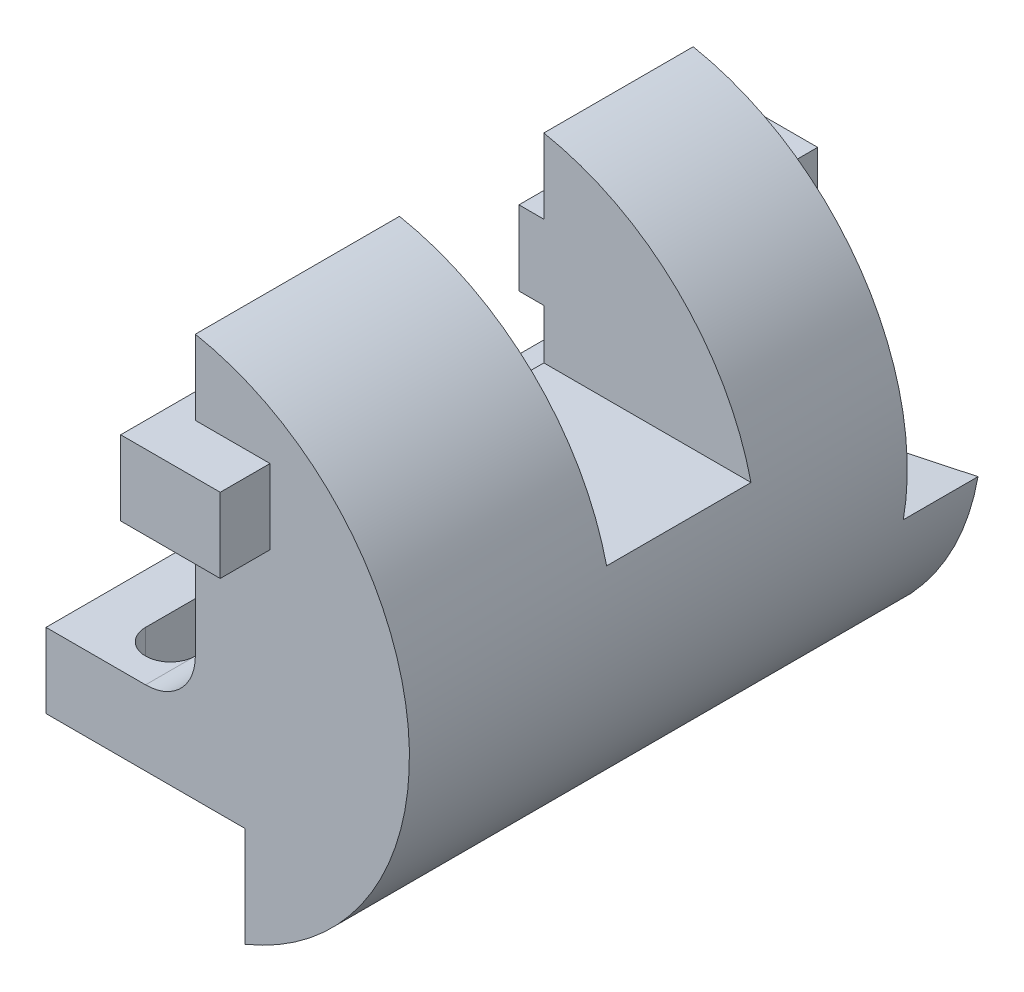
ISO-10303-21;
HEADER;
FILE_DESCRIPTION(('STEP AP214'),'2;1');
FILE_NAME('part.step','',(''),(''),'','','');
FILE_SCHEMA(('AUTOMOTIVE_DESIGN { 1 0 10303 214 1 1 1 1 }'));
ENDSEC;
DATA;
#1=APPLICATION_CONTEXT('core data for automotive mechanical design processes');
#2=APPLICATION_PROTOCOL_DEFINITION('international standard','automotive_design',2000,#1);
#3=PRODUCT_CONTEXT('',#1,'mechanical');
#4=PRODUCT('Part','Part','',(#3));
#5=PRODUCT_RELATED_PRODUCT_CATEGORY('part','',(#4));
#6=PRODUCT_DEFINITION_FORMATION('','',#4);
#7=PRODUCT_DEFINITION_CONTEXT('part definition',#1,'design');
#8=PRODUCT_DEFINITION('design','',#6,#7);
#9=PRODUCT_DEFINITION_SHAPE('','',#8);
#10=(LENGTH_UNIT() NAMED_UNIT(*) SI_UNIT(.MILLI.,.METRE.));
#11=(NAMED_UNIT(*) PLANE_ANGLE_UNIT() SI_UNIT($,.RADIAN.));
#12=(NAMED_UNIT(*) SI_UNIT($,.STERADIAN.) SOLID_ANGLE_UNIT());
#13=UNCERTAINTY_MEASURE_WITH_UNIT(LENGTH_MEASURE(1.E-05),#10,'distance_accuracy_value','');
#14=(GEOMETRIC_REPRESENTATION_CONTEXT(3) GLOBAL_UNCERTAINTY_ASSIGNED_CONTEXT((#13)) GLOBAL_UNIT_ASSIGNED_CONTEXT((#10,
#11,#12)) REPRESENTATION_CONTEXT('',''));
#15=CARTESIAN_POINT('',(0.,0.,0.));
#16=DIRECTION('',(0.,0.,1.));
#17=DIRECTION('',(1.,0.,0.));
#18=AXIS2_PLACEMENT_3D('',#15,#16,#17);
#19=CARTESIAN_POINT('',(0.,0.,100.));
#20=DIRECTION('',(-1.,0.,0.));
#21=DIRECTION('',(0.,0.,1.));
#22=AXIS2_PLACEMENT_3D('',#19,#20,#21);
#23=PLANE('',#22);
#24=DIRECTION('',(0.,-1.,0.));
#25=VECTOR('',#24,1.);
#26=CARTESIAN_POINT('',(0.,0.,30.));
#27=LINE('',#26,#25);
#28=CARTESIAN_POINT('',(0.,66.,30.));
#29=VERTEX_POINT('',#28);
#30=CARTESIAN_POINT('',(0.,51.,30.));
#31=VERTEX_POINT('',#30);
#32=EDGE_CURVE('E499',#29,#31,#27,.T.);
#33=ORIENTED_EDGE('',*,*,#32,.F.);
#34=DIRECTION('',(0.,0.,-1.));
#35=VECTOR('',#34,1.);
#36=CARTESIAN_POINT('',(0.,66.,100.));
#37=LINE('',#36,#35);
#38=CARTESIAN_POINT('',(0.,66.,0.));
#39=VERTEX_POINT('',#38);
#40=EDGE_CURVE('E261',#29,#39,#37,.T.);
#41=ORIENTED_EDGE('',*,*,#40,.T.);
#42=DIRECTION('',(0.,1.,0.));
#43=VECTOR('',#42,1.);
#44=CARTESIAN_POINT('',(0.,0.,0.));
#45=LINE('',#44,#43);
#46=CARTESIAN_POINT('',(0.,51.,0.));
#47=VERTEX_POINT('',#46);
#48=EDGE_CURVE('E325',#47,#39,#45,.T.);
#49=ORIENTED_EDGE('',*,*,#48,.F.);
#50=DIRECTION('',(0.,0.,1.));
#51=VECTOR('',#50,1.);
#52=CARTESIAN_POINT('',(0.,51.,100.));
#53=LINE('',#52,#51);
#54=EDGE_CURVE('E437',#47,#31,#53,.T.);
#55=ORIENTED_EDGE('',*,*,#54,.T.);
#56=EDGE_LOOP('',(#33,#41,#49,#55));
#57=FACE_BOUND('',#56,.T.);
#58=ADVANCED_FACE('F44',(#57),#23,.T.);
#59=CARTESIAN_POINT('',(-5.,36.,110.));
#60=DIRECTION('',(0.,1.,0.));
#61=DIRECTION('',(0.,0.,1.));
#62=AXIS2_PLACEMENT_3D('',#59,#60,#61);
#63=PLANE('',#62);
#64=DIRECTION('',(0.,0.,-1.));
#65=VECTOR('',#64,1.);
#66=CARTESIAN_POINT('',(0.,36.,100.));
#67=LINE('',#66,#65);
#68=CARTESIAN_POINT('',(0.,36.,30.));
#69=VERTEX_POINT('',#68);
#70=CARTESIAN_POINT('',(0.,36.,0.));
#71=VERTEX_POINT('',#70);
#72=EDGE_CURVE('E430',#69,#71,#67,.T.);
#73=ORIENTED_EDGE('',*,*,#72,.F.);
#74=DIRECTION('',(-1.,0.,0.));
#75=VECTOR('',#74,1.);
#76=CARTESIAN_POINT('',(-5.,36.,30.));
#77=LINE('',#76,#75);
#78=CARTESIAN_POINT('',(-5.,36.,30.));
#79=VERTEX_POINT('',#78);
#80=EDGE_CURVE('E502',#69,#79,#77,.T.);
#81=ORIENTED_EDGE('',*,*,#80,.T.);
#82=DIRECTION('',(0.,0.,-1.));
#83=VECTOR('',#82,1.);
#84=CARTESIAN_POINT('',(-5.,36.,110.));
#85=LINE('',#84,#83);
#86=CARTESIAN_POINT('',(-5.,36.,-9.99999999999999));
#87=VERTEX_POINT('',#86);
#88=EDGE_CURVE('E446',#79,#87,#85,.T.);
#89=ORIENTED_EDGE('',*,*,#88,.T.);
#90=DIRECTION('',(1.,0.,0.));
#91=VECTOR('',#90,1.);
#92=CARTESIAN_POINT('',(-5.,36.,-9.99999999999999));
#93=LINE('',#92,#91);
#94=CARTESIAN_POINT('',(15.,36.,-9.99999999999999));
#95=VERTEX_POINT('',#94);
#96=EDGE_CURVE('E482',#87,#95,#93,.T.);
#97=ORIENTED_EDGE('',*,*,#96,.T.);
#98=DIRECTION('',(0.,0.,-1.));
#99=VECTOR('',#98,1.);
#100=CARTESIAN_POINT('',(15.,36.,110.));
#101=LINE('',#100,#99);
#102=CARTESIAN_POINT('',(15.,36.,0.));
#103=VERTEX_POINT('',#102);
#104=EDGE_CURVE('E451',#103,#95,#101,.T.);
#105=ORIENTED_EDGE('',*,*,#104,.F.);
#106=DIRECTION('',(-1.,0.,0.));
#107=VECTOR('',#106,1.);
#108=CARTESIAN_POINT('',(-9.99999999999999,36.,0.));
#109=LINE('',#108,#107);
#110=EDGE_CURVE('E422',#103,#71,#109,.T.);
#111=ORIENTED_EDGE('',*,*,#110,.T.);
#112=EDGE_LOOP('',(#73,#81,#89,#97,#105,#111));
#113=FACE_BOUND('',#112,.T.);
#114=ADVANCED_FACE('F575',(#113),#63,.F.);
#115=CARTESIAN_POINT('',(-5.,51.,110.));
#116=DIRECTION('',(0.,-1.,0.));
#117=DIRECTION('',(0.,0.,-1.));
#118=AXIS2_PLACEMENT_3D('',#115,#116,#117);
#119=PLANE('',#118);
#120=DIRECTION('',(0.,0.,-1.));
#121=VECTOR('',#120,1.);
#122=CARTESIAN_POINT('',(-5.,51.,110.));
#123=LINE('',#122,#121);
#124=CARTESIAN_POINT('',(-5.,51.,30.));
#125=VERTEX_POINT('',#124);
#126=CARTESIAN_POINT('',(-5.,51.,-9.99999999999999));
#127=VERTEX_POINT('',#126);
#128=EDGE_CURVE('E460',#125,#127,#123,.T.);
#129=ORIENTED_EDGE('',*,*,#128,.F.);
#130=DIRECTION('',(1.,0.,0.));
#131=VECTOR('',#130,1.);
#132=CARTESIAN_POINT('',(-5.,51.,30.));
#133=LINE('',#132,#131);
#134=EDGE_CURVE('E253',#125,#31,#133,.T.);
#135=ORIENTED_EDGE('',*,*,#134,.T.);
#136=ORIENTED_EDGE('',*,*,#54,.F.);
#137=DIRECTION('',(1.,0.,0.));
#138=VECTOR('',#137,1.);
#139=CARTESIAN_POINT('',(-9.99999999999999,51.,0.));
#140=LINE('',#139,#138);
#141=CARTESIAN_POINT('',(15.,51.,0.));
#142=VERTEX_POINT('',#141);
#143=EDGE_CURVE('E434',#47,#142,#140,.T.);
#144=ORIENTED_EDGE('',*,*,#143,.T.);
#145=DIRECTION('',(0.,0.,-1.));
#146=VECTOR('',#145,1.);
#147=CARTESIAN_POINT('',(15.,51.,110.));
#148=LINE('',#147,#146);
#149=CARTESIAN_POINT('',(15.,51.,-9.99999999999999));
#150=VERTEX_POINT('',#149);
#151=EDGE_CURVE('E455',#142,#150,#148,.T.);
#152=ORIENTED_EDGE('',*,*,#151,.T.);
#153=DIRECTION('',(-1.,0.,0.));
#154=VECTOR('',#153,1.);
#155=CARTESIAN_POINT('',(-5.,51.,-9.99999999999999));
#156=LINE('',#155,#154);
#157=EDGE_CURVE('E474',#150,#127,#156,.T.);
#158=ORIENTED_EDGE('',*,*,#157,.T.);
#159=EDGE_LOOP('',(#129,#135,#136,#144,#152,#158));
#160=FACE_BOUND('',#159,.T.);
#161=ADVANCED_FACE('F566',(#160),#119,.F.);
#162=CARTESIAN_POINT('',(-5.,51.,110.));
#163=DIRECTION('',(1.,0.,0.));
#164=DIRECTION('',(0.,1.,0.));
#165=AXIS2_PLACEMENT_3D('',#162,#163,#164);
#166=PLANE('',#165);
#167=ORIENTED_EDGE('',*,*,#88,.F.);
#168=DIRECTION('',(0.,1.,0.));
#169=VECTOR('',#168,1.);
#170=CARTESIAN_POINT('',(-5.,51.,30.));
#171=LINE('',#170,#169);
#172=EDGE_CURVE('E287',#79,#125,#171,.T.);
#173=ORIENTED_EDGE('',*,*,#172,.T.);
#174=ORIENTED_EDGE('',*,*,#128,.T.);
#175=DIRECTION('',(0.,-1.,0.));
#176=VECTOR('',#175,1.);
#177=CARTESIAN_POINT('',(-5.,51.,-9.99999999999999));
#178=LINE('',#177,#176);
#179=EDGE_CURVE('E486',#127,#87,#178,.T.);
#180=ORIENTED_EDGE('',*,*,#179,.T.);
#181=EDGE_LOOP('',(#167,#173,#174,#180));
#182=FACE_BOUND('',#181,.T.);
#183=ADVANCED_FACE('F559',(#182),#166,.F.);
#184=CARTESIAN_POINT('',(-9.99999999999999,13.9519452813076,0.));
#185=DIRECTION('',(0.,0.,1.));
#186=DIRECTION('',(1.,0.,0.));
#187=AXIS2_PLACEMENT_3D('',#184,#185,#186);
#188=PLANE('',#187);
#189=ORIENTED_EDGE('',*,*,#110,.F.);
#190=DIRECTION('',(0.,-1.,0.));
#191=VECTOR('',#190,1.);
#192=CARTESIAN_POINT('',(15.,13.9519452813076,0.));
#193=LINE('',#192,#191);
#194=EDGE_CURVE('E431',#142,#103,#193,.T.);
#195=ORIENTED_EDGE('',*,*,#194,.F.);
#196=ORIENTED_EDGE('',*,*,#143,.F.);
#197=ORIENTED_EDGE('',*,*,#48,.T.);
#198=CARTESIAN_POINT('',(-9.99999999999999,13.9519452813076,0.));
#199=DIRECTION('',(0.,0.,1.));
#200=DIRECTION('',(1.,0.,0.));
#201=AXIS2_PLACEMENT_3D('',#198,#199,#200);
#202=CIRCLE('',#201,53.);
#203=CARTESIAN_POINT('',(42.207179875418,4.81901752205368,0.));
#204=VERTEX_POINT('',#203);
#205=EDGE_CURVE('E318',#204,#39,#202,.T.);
#206=ORIENTED_EDGE('',*,*,#205,.F.);
#207=DIRECTION('',(0.978147600733805,0.207911690817763,0.));
#208=VECTOR('',#207,1.);
#209=CARTESIAN_POINT('',(0.844465705241106,-3.97289878329919,0.));
#210=LINE('',#209,#208);
#211=CARTESIAN_POINT('',(-30.,-10.5290923601543,0.));
#212=VERTEX_POINT('',#211);
#213=EDGE_CURVE('E357',#212,#204,#210,.T.);
#214=ORIENTED_EDGE('',*,*,#213,.F.);
#215=DIRECTION('',(0.,1.,0.));
#216=VECTOR('',#215,1.);
#217=CARTESIAN_POINT('',(-30.,-15.,0.));
#218=LINE('',#217,#216);
#219=CARTESIAN_POINT('',(-30.,0.,0.));
#220=VERTEX_POINT('',#219);
#221=EDGE_CURVE('E314',#212,#220,#218,.T.);
#222=ORIENTED_EDGE('',*,*,#221,.T.);
#223=DIRECTION('',(1.,0.,0.));
#224=VECTOR('',#223,1.);
#225=CARTESIAN_POINT('',(-30.,0.,0.));
#226=LINE('',#225,#224);
#227=CARTESIAN_POINT('',(-10.,0.,0.));
#228=VERTEX_POINT('',#227);
#229=EDGE_CURVE('E326',#220,#228,#226,.T.);
#230=ORIENTED_EDGE('',*,*,#229,.T.);
#231=CARTESIAN_POINT('',(-10.,10.,0.));
#232=DIRECTION('',(0.,0.,1.));
#233=DIRECTION('',(1.,0.,0.));
#234=AXIS2_PLACEMENT_3D('',#231,#232,#233);
#235=CIRCLE('',#234,10.);
#236=CARTESIAN_POINT('',(0.,10.,0.));
#237=VERTEX_POINT('',#236);
#238=EDGE_CURVE('E53',#228,#237,#235,.T.);
#239=ORIENTED_EDGE('',*,*,#238,.T.);
#240=EDGE_CURVE('E322',#237,#71,#45,.T.);
#241=ORIENTED_EDGE('',*,*,#240,.T.);
#242=EDGE_LOOP('',(#189,#195,#196,#197,#206,#214,#222,#230,#239,#241));
#243=FACE_BOUND('',#242,.T.);
#244=ADVANCED_FACE('F582',(#243),#188,.F.);
#245=ORIENTED_EDGE('',*,*,#240,.F.);
#246=DIRECTION('',(0.,0.,-1.));
#247=VECTOR('',#246,1.);
#248=CARTESIAN_POINT('',(0.,10.,100.));
#249=LINE('',#248,#247);
#250=CARTESIAN_POINT('',(0.,10.,100.));
#251=VERTEX_POINT('',#250);
#252=EDGE_CURVE('E60',#237,#251,#249,.F.);
#253=ORIENTED_EDGE('',*,*,#252,.T.);
#254=DIRECTION('',(0.,1.,0.));
#255=VECTOR('',#254,1.);
#256=CARTESIAN_POINT('',(0.,0.,100.));
#257=LINE('',#256,#255);
#258=CARTESIAN_POINT('',(0.,36.,100.));
#259=VERTEX_POINT('',#258);
#260=EDGE_CURVE('E343',#251,#259,#257,.T.);
#261=ORIENTED_EDGE('',*,*,#260,.T.);
#262=CARTESIAN_POINT('',(0.,36.,59.));
#263=VERTEX_POINT('',#262);
#264=EDGE_CURVE('E426',#259,#263,#67,.T.);
#265=ORIENTED_EDGE('',*,*,#264,.T.);
#266=DIRECTION('',(0.,1.,0.));
#267=VECTOR('',#266,1.);
#268=CARTESIAN_POINT('',(0.,0.,59.));
#269=LINE('',#268,#267);
#270=CARTESIAN_POINT('',(0.,26.,59.));
#271=VERTEX_POINT('',#270);
#272=EDGE_CURVE('E240',#271,#263,#269,.T.);
#273=ORIENTED_EDGE('',*,*,#272,.F.);
#274=DIRECTION('',(0.,0.,1.));
#275=VECTOR('',#274,1.);
#276=CARTESIAN_POINT('',(0.,26.,100.));
#277=LINE('',#276,#275);
#278=CARTESIAN_POINT('',(0.,26.,30.));
#279=VERTEX_POINT('',#278);
#280=EDGE_CURVE('E490',#279,#271,#277,.T.);
#281=ORIENTED_EDGE('',*,*,#280,.F.);
#282=DIRECTION('',(0.,-1.,0.));
#283=VECTOR('',#282,1.);
#284=CARTESIAN_POINT('',(0.,0.,30.));
#285=LINE('',#284,#283);
#286=EDGE_CURVE('E496',#69,#279,#285,.T.);
#287=ORIENTED_EDGE('',*,*,#286,.F.);
#288=ORIENTED_EDGE('',*,*,#72,.T.);
#289=EDGE_LOOP('',(#245,#253,#261,#265,#273,#281,#287,#288));
#290=FACE_BOUND('',#289,.T.);
#291=ADVANCED_FACE('F525',(#290),#23,.T.);
#292=DIRECTION('',(0.,1.,0.));
#293=VECTOR('',#292,1.);
#294=CARTESIAN_POINT('',(0.,0.,59.));
#295=LINE('',#294,#293);
#296=CARTESIAN_POINT('',(0.,51.,59.));
#297=VERTEX_POINT('',#296);
#298=CARTESIAN_POINT('',(0.,66.,59.));
#299=VERTEX_POINT('',#298);
#300=EDGE_CURVE('E228',#297,#299,#295,.T.);
#301=ORIENTED_EDGE('',*,*,#300,.F.);
#302=CARTESIAN_POINT('',(0.,51.,100.));
#303=VERTEX_POINT('',#302);
#304=EDGE_CURVE('E441',#297,#303,#53,.T.);
#305=ORIENTED_EDGE('',*,*,#304,.T.);
#306=CARTESIAN_POINT('',(0.,66.,100.));
#307=VERTEX_POINT('',#306);
#308=EDGE_CURVE('E257',#303,#307,#257,.T.);
#309=ORIENTED_EDGE('',*,*,#308,.T.);
#310=EDGE_CURVE('E249',#307,#299,#37,.T.);
#311=ORIENTED_EDGE('',*,*,#310,.T.);
#312=EDGE_LOOP('',(#301,#305,#309,#311));
#313=FACE_BOUND('',#312,.T.);
#314=ADVANCED_FACE('F255',(#313),#23,.T.);
#315=CARTESIAN_POINT('',(-9.99999999999999,13.9519452813076,100.));
#316=DIRECTION('',(0.,0.,1.));
#317=DIRECTION('',(1.,0.,0.));
#318=AXIS2_PLACEMENT_3D('',#315,#316,#317);
#319=PLANE('',#318);
#320=DIRECTION('',(0.,-1.,0.));
#321=VECTOR('',#320,1.);
#322=CARTESIAN_POINT('',(15.,13.9519452813076,100.));
#323=LINE('',#322,#321);
#324=CARTESIAN_POINT('',(15.,51.,100.));
#325=VERTEX_POINT('',#324);
#326=CARTESIAN_POINT('',(15.,36.,100.));
#327=VERTEX_POINT('',#326);
#328=EDGE_CURVE('E274',#325,#327,#323,.T.);
#329=ORIENTED_EDGE('',*,*,#328,.T.);
#330=DIRECTION('',(-1.,0.,0.));
#331=VECTOR('',#330,1.);
#332=CARTESIAN_POINT('',(-9.99999999999999,36.,100.));
#333=LINE('',#332,#331);
#334=EDGE_CURVE('E279',#327,#259,#333,.T.);
#335=ORIENTED_EDGE('',*,*,#334,.T.);
#336=ORIENTED_EDGE('',*,*,#260,.F.);
#337=CARTESIAN_POINT('',(-10.,10.,100.));
#338=DIRECTION('',(0.,0.,1.));
#339=DIRECTION('',(1.,0.,0.));
#340=AXIS2_PLACEMENT_3D('',#337,#338,#339);
#341=CIRCLE('',#340,10.);
#342=CARTESIAN_POINT('',(-10.,0.,100.));
#343=VERTEX_POINT('',#342);
#344=EDGE_CURVE('E11',#251,#343,#341,.F.);
#345=ORIENTED_EDGE('',*,*,#344,.T.);
#346=DIRECTION('',(1.,0.,0.));
#347=VECTOR('',#346,1.);
#348=CARTESIAN_POINT('',(-30.,0.,100.));
#349=LINE('',#348,#347);
#350=CARTESIAN_POINT('',(-30.,0.,100.));
#351=VERTEX_POINT('',#350);
#352=EDGE_CURVE('E317',#351,#343,#349,.T.);
#353=ORIENTED_EDGE('',*,*,#352,.F.);
#354=DIRECTION('',(0.,1.,0.));
#355=VECTOR('',#354,1.);
#356=CARTESIAN_POINT('',(-30.,-15.,100.));
#357=LINE('',#356,#355);
#358=CARTESIAN_POINT('',(-30.,-15.,100.));
#359=VERTEX_POINT('',#358);
#360=EDGE_CURVE('E267',#359,#351,#357,.T.);
#361=ORIENTED_EDGE('',*,*,#360,.F.);
#362=DIRECTION('',(-1.,0.,0.));
#363=VECTOR('',#362,1.);
#364=CARTESIAN_POINT('',(10.,-15.,100.));
#365=LINE('',#364,#363);
#366=CARTESIAN_POINT('',(10.,-15.,100.));
#367=VERTEX_POINT('',#366);
#368=EDGE_CURVE('E333',#367,#359,#365,.T.);
#369=ORIENTED_EDGE('',*,*,#368,.F.);
#370=DIRECTION('',(0.,1.,0.));
#371=VECTOR('',#370,1.);
#372=CARTESIAN_POINT('',(10.,-35.1296194859245,100.));
#373=LINE('',#372,#371);
#374=CARTESIAN_POINT('',(9.99999999999998,-35.1296194859245,100.));
#375=VERTEX_POINT('',#374);
#376=EDGE_CURVE('E337',#375,#367,#373,.T.);
#377=ORIENTED_EDGE('',*,*,#376,.F.);
#378=CARTESIAN_POINT('',(-9.99999999999999,13.9519452813076,100.));
#379=DIRECTION('',(0.,0.,1.));
#380=DIRECTION('',(1.,0.,0.));
#381=AXIS2_PLACEMENT_3D('',#378,#379,#380);
#382=CIRCLE('',#381,53.);
#383=EDGE_CURVE('E340',#375,#307,#382,.T.);
#384=ORIENTED_EDGE('',*,*,#383,.T.);
#385=ORIENTED_EDGE('',*,*,#308,.F.);
#386=DIRECTION('',(1.,0.,0.));
#387=VECTOR('',#386,1.);
#388=CARTESIAN_POINT('',(-9.99999999999999,51.,100.));
#389=LINE('',#388,#387);
#390=EDGE_CURVE('E270',#303,#325,#389,.T.);
#391=ORIENTED_EDGE('',*,*,#390,.T.);
#392=EDGE_LOOP('',(#329,#335,#336,#345,#353,#361,#369,#377,#384,#385,#391));
#393=FACE_BOUND('',#392,.T.);
#394=ADVANCED_FACE('F532',(#393),#319,.T.);
#395=CARTESIAN_POINT('',(-30.,0.,100.));
#396=DIRECTION('',(0.,1.,0.));
#397=DIRECTION('',(0.,0.,1.));
#398=AXIS2_PLACEMENT_3D('',#395,#396,#397);
#399=PLANE('',#398);
#400=ORIENTED_EDGE('',*,*,#352,.T.);
#401=DIRECTION('',(0.,0.,-1.));
#402=VECTOR('',#401,1.);
#403=CARTESIAN_POINT('',(-10.,0.,0.));
#404=LINE('',#403,#402);
#405=CARTESIAN_POINT('',(-9.99999999999999,0.,90.));
#406=VERTEX_POINT('',#405);
#407=EDGE_CURVE('E296',#343,#406,#404,.T.);
#408=ORIENTED_EDGE('',*,*,#407,.T.);
#409=CARTESIAN_POINT('',(-15.,0.,90.));
#410=DIRECTION('',(0.,1.,0.));
#411=DIRECTION('',(0.,0.,1.));
#412=AXIS2_PLACEMENT_3D('',#409,#410,#411);
#413=CIRCLE('',#412,5.);
#414=CARTESIAN_POINT('',(-20.,0.,90.));
#415=VERTEX_POINT('',#414);
#416=EDGE_CURVE('E386',#406,#415,#413,.F.);
#417=ORIENTED_EDGE('',*,*,#416,.T.);
#418=DIRECTION('',(0.,0.,-1.));
#419=VECTOR('',#418,1.);
#420=CARTESIAN_POINT('',(-20.,0.,100.));
#421=LINE('',#420,#419);
#422=CARTESIAN_POINT('',(-20.,0.,10.));
#423=VERTEX_POINT('',#422);
#424=EDGE_CURVE('E382',#415,#423,#421,.T.);
#425=ORIENTED_EDGE('',*,*,#424,.T.);
#426=CARTESIAN_POINT('',(-15.,0.,10.));
#427=DIRECTION('',(0.,1.,0.));
#428=DIRECTION('',(0.,0.,1.));
#429=AXIS2_PLACEMENT_3D('',#426,#427,#428);
#430=CIRCLE('',#429,5.);
#431=CARTESIAN_POINT('',(-9.99999999999999,0.,10.));
#432=VERTEX_POINT('',#431);
#433=EDGE_CURVE('E362',#423,#432,#430,.F.);
#434=ORIENTED_EDGE('',*,*,#433,.T.);
#435=DIRECTION('',(0.,0.,-1.));
#436=VECTOR('',#435,1.);
#437=CARTESIAN_POINT('',(-10.,0.,0.));
#438=LINE('',#437,#436);
#439=EDGE_CURVE('E293',#432,#228,#438,.T.);
#440=ORIENTED_EDGE('',*,*,#439,.T.);
#441=ORIENTED_EDGE('',*,*,#229,.F.);
#442=DIRECTION('',(0.,0.,-1.));
#443=VECTOR('',#442,1.);
#444=CARTESIAN_POINT('',(-30.,0.,100.));
#445=LINE('',#444,#443);
#446=EDGE_CURVE('E275',#351,#220,#445,.T.);
#447=ORIENTED_EDGE('',*,*,#446,.F.);
#448=EDGE_LOOP('',(#400,#408,#417,#425,#434,#440,#441,#447));
#449=FACE_BOUND('',#448,.T.);
#450=ADVANCED_FACE('F605',(#449),#399,.T.);
#451=CARTESIAN_POINT('',(10.,-15.,100.));
#452=DIRECTION('',(0.,-1.,0.));
#453=DIRECTION('',(1.,0.,0.));
#454=AXIS2_PLACEMENT_3D('',#451,#452,#453);
#455=PLANE('',#454);
#456=DIRECTION('',(0.,0.,-1.));
#457=VECTOR('',#456,1.);
#458=CARTESIAN_POINT('',(-30.,-15.,100.));
#459=LINE('',#458,#457);
#460=CARTESIAN_POINT('',(-30.,-15.,-15.));
#461=VERTEX_POINT('',#460);
#462=EDGE_CURVE('E305',#359,#461,#459,.T.);
#463=ORIENTED_EDGE('',*,*,#462,.T.);
#464=DIRECTION('',(-1.,0.,0.));
#465=VECTOR('',#464,1.);
#466=CARTESIAN_POINT('',(0.,-15.,-15.));
#467=LINE('',#466,#465);
#468=CARTESIAN_POINT('',(10.,-15.,-15.));
#469=VERTEX_POINT('',#468);
#470=EDGE_CURVE('E356',#469,#461,#467,.T.);
#471=ORIENTED_EDGE('',*,*,#470,.F.);
#472=DIRECTION('',(0.,0.,-1.));
#473=VECTOR('',#472,1.);
#474=CARTESIAN_POINT('',(10.,-15.,100.));
#475=LINE('',#474,#473);
#476=EDGE_CURVE('E265',#367,#469,#475,.T.);
#477=ORIENTED_EDGE('',*,*,#476,.F.);
#478=ORIENTED_EDGE('',*,*,#368,.T.);
#479=EDGE_LOOP('',(#463,#471,#477,#478));
#480=FACE_BOUND('',#479,.T.);
#481=DIRECTION('',(0.,0.,-1.));
#482=VECTOR('',#481,1.);
#483=CARTESIAN_POINT('',(-9.99999999999999,-15.,90.));
#484=LINE('',#483,#482);
#485=CARTESIAN_POINT('',(-9.99999999999999,-15.,90.));
#486=VERTEX_POINT('',#485);
#487=CARTESIAN_POINT('',(-9.99999999999999,-15.,9.99999999999999));
#488=VERTEX_POINT('',#487);
#489=EDGE_CURVE('E414',#486,#488,#484,.T.);
#490=ORIENTED_EDGE('',*,*,#489,.T.);
#491=CARTESIAN_POINT('',(-15.,-15.,10.));
#492=DIRECTION('',(0.,-1.,0.));
#493=DIRECTION('',(1.,0.,0.));
#494=AXIS2_PLACEMENT_3D('',#491,#492,#493);
#495=CIRCLE('',#494,5.);
#496=CARTESIAN_POINT('',(-20.,-15.,10.));
#497=VERTEX_POINT('',#496);
#498=EDGE_CURVE('E410',#488,#497,#495,.F.);
#499=ORIENTED_EDGE('',*,*,#498,.T.);
#500=DIRECTION('',(0.,0.,1.));
#501=VECTOR('',#500,1.);
#502=CARTESIAN_POINT('',(-20.,-15.,10.));
#503=LINE('',#502,#501);
#504=CARTESIAN_POINT('',(-20.,-15.,90.));
#505=VERTEX_POINT('',#504);
#506=EDGE_CURVE('E406',#497,#505,#503,.T.);
#507=ORIENTED_EDGE('',*,*,#506,.T.);
#508=CARTESIAN_POINT('',(-15.,-15.,90.));
#509=DIRECTION('',(0.,-1.,0.));
#510=DIRECTION('',(1.,0.,0.));
#511=AXIS2_PLACEMENT_3D('',#508,#509,#510);
#512=CIRCLE('',#511,5.);
#513=EDGE_CURVE('E418',#505,#486,#512,.F.);
#514=ORIENTED_EDGE('',*,*,#513,.T.);
#515=EDGE_LOOP('',(#490,#499,#507,#514));
#516=FACE_BOUND('',#515,.T.);
#517=ADVANCED_FACE('F623',(#480,#516),#455,.T.);
#518=CARTESIAN_POINT('',(-30.,-15.,100.));
#519=DIRECTION('',(-1.,0.,0.));
#520=DIRECTION('',(0.,0.,1.));
#521=AXIS2_PLACEMENT_3D('',#518,#519,#520);
#522=PLANE('',#521);
#523=ORIENTED_EDGE('',*,*,#221,.F.);
#524=DIRECTION('',(0.,0.,1.));
#525=VECTOR('',#524,1.);
#526=CARTESIAN_POINT('',(-30.,-10.5290923601543,-15.));
#527=LINE('',#526,#525);
#528=CARTESIAN_POINT('',(-30.,-10.5290923601543,-15.));
#529=VERTEX_POINT('',#528);
#530=EDGE_CURVE('E329',#529,#212,#527,.T.);
#531=ORIENTED_EDGE('',*,*,#530,.F.);
#532=DIRECTION('',(0.,1.,0.));
#533=VECTOR('',#532,1.);
#534=CARTESIAN_POINT('',(-30.,0.,-15.));
#535=LINE('',#534,#533);
#536=EDGE_CURVE('E361',#461,#529,#535,.T.);
#537=ORIENTED_EDGE('',*,*,#536,.F.);
#538=ORIENTED_EDGE('',*,*,#462,.F.);
#539=ORIENTED_EDGE('',*,*,#360,.T.);
#540=ORIENTED_EDGE('',*,*,#446,.T.);
#541=EDGE_LOOP('',(#523,#531,#537,#538,#539,#540));
#542=FACE_BOUND('',#541,.T.);
#543=ADVANCED_FACE('F597',(#542),#522,.T.);
#544=CARTESIAN_POINT('',(10.,-35.1296194859245,100.));
#545=DIRECTION('',(-1.,0.,0.));
#546=DIRECTION('',(0.,-1.,0.));
#547=AXIS2_PLACEMENT_3D('',#544,#545,#546);
#548=PLANE('',#547);
#549=ORIENTED_EDGE('',*,*,#476,.T.);
#550=DIRECTION('',(0.,1.,0.));
#551=VECTOR('',#550,1.);
#552=CARTESIAN_POINT('',(10.,0.,-15.));
#553=LINE('',#552,#551);
#554=CARTESIAN_POINT('',(10.,-35.1296194859245,-15.));
#555=VERTEX_POINT('',#554);
#556=EDGE_CURVE('E366',#555,#469,#553,.T.);
#557=ORIENTED_EDGE('',*,*,#556,.F.);
#558=DIRECTION('',(0.,0.,-1.));
#559=VECTOR('',#558,1.);
#560=CARTESIAN_POINT('',(9.99999999999998,-35.1296194859245,100.));
#561=LINE('',#560,#559);
#562=EDGE_CURVE('E260',#375,#555,#561,.T.);
#563=ORIENTED_EDGE('',*,*,#562,.F.);
#564=ORIENTED_EDGE('',*,*,#376,.T.);
#565=EDGE_LOOP('',(#549,#557,#563,#564));
#566=FACE_BOUND('',#565,.T.);
#567=ADVANCED_FACE('F632',(#566),#548,.T.);
#568=CARTESIAN_POINT('',(-9.99999999999999,13.9519452813076,100.));
#569=DIRECTION('',(0.,0.,-1.));
#570=DIRECTION('',(-1.,0.,0.));
#571=AXIS2_PLACEMENT_3D('',#568,#569,#570);
#572=CYLINDRICAL_SURFACE('',#571,53.);
#573=ORIENTED_EDGE('',*,*,#40,.F.);
#574=CARTESIAN_POINT('',(-9.99999999999999,13.9519452813076,30.));
#575=DIRECTION('',(0.,0.,-1.));
#576=DIRECTION('',(0.,1.,0.));
#577=AXIS2_PLACEMENT_3D('',#574,#575,#576);
#578=CIRCLE('',#577,53.);
#579=CARTESIAN_POINT('',(41.612444017847,26.,30.));
#580=VERTEX_POINT('',#579);
#581=EDGE_CURVE('E493',#29,#580,#578,.T.);
#582=ORIENTED_EDGE('',*,*,#581,.T.);
#583=DIRECTION('',(0.,0.,-1.));
#584=VECTOR('',#583,1.);
#585=CARTESIAN_POINT('',(41.612444017847,26.,100.));
#586=LINE('',#585,#584);
#587=CARTESIAN_POINT('',(41.612444017847,26.,59.));
#588=VERTEX_POINT('',#587);
#589=EDGE_CURVE('E251',#580,#588,#586,.F.);
#590=ORIENTED_EDGE('',*,*,#589,.T.);
#591=CARTESIAN_POINT('',(-9.99999999999999,13.9519452813076,59.));
#592=DIRECTION('',(0.,0.,1.));
#593=DIRECTION('',(1.,0.,0.));
#594=AXIS2_PLACEMENT_3D('',#591,#592,#593);
#595=CIRCLE('',#594,53.);
#596=EDGE_CURVE('E232',#588,#299,#595,.T.);
#597=ORIENTED_EDGE('',*,*,#596,.T.);
#598=ORIENTED_EDGE('',*,*,#310,.F.);
#599=ORIENTED_EDGE('',*,*,#383,.F.);
#600=ORIENTED_EDGE('',*,*,#562,.T.);
#601=CARTESIAN_POINT('',(-9.99999999999999,13.9519452813076,-15.));
#602=DIRECTION('',(0.,0.,-1.));
#603=DIRECTION('',(-1.,0.,0.));
#604=AXIS2_PLACEMENT_3D('',#601,#602,#603);
#605=CIRCLE('',#604,53.);
#606=CARTESIAN_POINT('',(42.207179875418,4.81901752205368,-15.));
#607=VERTEX_POINT('',#606);
#608=EDGE_CURVE('E369',#607,#555,#605,.T.);
#609=ORIENTED_EDGE('',*,*,#608,.F.);
#610=DIRECTION('',(0.,0.,1.));
#611=VECTOR('',#610,1.);
#612=CARTESIAN_POINT('',(42.207179875418,4.81901752205368,-15.));
#613=LINE('',#612,#611);
#614=EDGE_CURVE('E352',#607,#204,#613,.T.);
#615=ORIENTED_EDGE('',*,*,#614,.T.);
#616=ORIENTED_EDGE('',*,*,#205,.T.);
#617=EDGE_LOOP('',(#573,#582,#590,#597,#598,#599,#600,#609,#615,#616));
#618=FACE_BOUND('',#617,.T.);
#619=ADVANCED_FACE('F247',(#618),#572,.T.);
#620=CARTESIAN_POINT('',(0.844465705241106,-3.97289878329919,-15.));
#621=DIRECTION('',(0.207911690817763,-0.978147600733805,0.));
#622=DIRECTION('',(0.978147600733805,0.207911690817763,0.));
#623=AXIS2_PLACEMENT_3D('',#620,#621,#622);
#624=PLANE('',#623);
#625=ORIENTED_EDGE('',*,*,#213,.T.);
#626=ORIENTED_EDGE('',*,*,#614,.F.);
#627=DIRECTION('',(0.978147600733805,0.207911690817763,0.));
#628=VECTOR('',#627,1.);
#629=CARTESIAN_POINT('',(0.844465705241106,-3.97289878329919,-15.));
#630=LINE('',#629,#628);
#631=EDGE_CURVE('E373',#529,#607,#630,.T.);
#632=ORIENTED_EDGE('',*,*,#631,.F.);
#633=ORIENTED_EDGE('',*,*,#530,.T.);
#634=EDGE_LOOP('',(#625,#626,#632,#633));
#635=FACE_BOUND('',#634,.T.);
#636=ADVANCED_FACE('F593',(#635),#624,.F.);
#637=CARTESIAN_POINT('',(0.,0.,-15.));
#638=DIRECTION('',(0.,0.,-1.));
#639=DIRECTION('',(-1.,0.,0.));
#640=AXIS2_PLACEMENT_3D('',#637,#638,#639);
#641=PLANE('',#640);
#642=ORIENTED_EDGE('',*,*,#536,.T.);
#643=ORIENTED_EDGE('',*,*,#631,.T.);
#644=ORIENTED_EDGE('',*,*,#608,.T.);
#645=ORIENTED_EDGE('',*,*,#556,.T.);
#646=ORIENTED_EDGE('',*,*,#470,.T.);
#647=EDGE_LOOP('',(#642,#643,#644,#645,#646));
#648=FACE_BOUND('',#647,.T.);
#649=ADVANCED_FACE('F660',(#648),#641,.T.);
#650=CARTESIAN_POINT('',(-15.,66.,10.));
#651=DIRECTION('',(0.,-1.,0.));
#652=DIRECTION('',(0.,0.,-1.));
#653=AXIS2_PLACEMENT_3D('',#650,#651,#652);
#654=CYLINDRICAL_SURFACE('',#653,5.);
#655=DIRECTION('',(0.,-1.,0.));
#656=VECTOR('',#655,1.);
#657=CARTESIAN_POINT('',(-20.,66.,10.));
#658=LINE('',#657,#656);
#659=EDGE_CURVE('E393',#423,#497,#658,.T.);
#660=ORIENTED_EDGE('',*,*,#659,.T.);
#661=ORIENTED_EDGE('',*,*,#498,.F.);
#662=DIRECTION('',(0.,-1.,0.));
#663=VECTOR('',#662,1.);
#664=CARTESIAN_POINT('',(-9.99999999999999,66.,10.));
#665=LINE('',#664,#663);
#666=EDGE_CURVE('E402',#432,#488,#665,.T.);
#667=ORIENTED_EDGE('',*,*,#666,.F.);
#668=ORIENTED_EDGE('',*,*,#433,.F.);
#669=EDGE_LOOP('',(#660,#661,#667,#668));
#670=FACE_BOUND('',#669,.T.);
#671=ADVANCED_FACE('F621',(#670),#654,.F.);
#672=CARTESIAN_POINT('',(-20.,66.,10.));
#673=DIRECTION('',(1.,0.,0.));
#674=DIRECTION('',(0.,0.,-1.));
#675=AXIS2_PLACEMENT_3D('',#672,#673,#674);
#676=PLANE('',#675);
#677=DIRECTION('',(0.,-1.,0.));
#678=VECTOR('',#677,1.);
#679=CARTESIAN_POINT('',(-20.,66.,90.));
#680=LINE('',#679,#678);
#681=EDGE_CURVE('E396',#415,#505,#680,.T.);
#682=ORIENTED_EDGE('',*,*,#681,.T.);
#683=ORIENTED_EDGE('',*,*,#506,.F.);
#684=ORIENTED_EDGE('',*,*,#659,.F.);
#685=ORIENTED_EDGE('',*,*,#424,.F.);
#686=EDGE_LOOP('',(#682,#683,#684,#685));
#687=FACE_BOUND('',#686,.T.);
#688=ADVANCED_FACE('F618',(#687),#676,.T.);
#689=CARTESIAN_POINT('',(-15.,66.,90.));
#690=DIRECTION('',(0.,-1.,0.));
#691=DIRECTION('',(0.,0.,-1.));
#692=AXIS2_PLACEMENT_3D('',#689,#690,#691);
#693=CYLINDRICAL_SURFACE('',#692,5.);
#694=DIRECTION('',(0.,-1.,0.));
#695=VECTOR('',#694,1.);
#696=CARTESIAN_POINT('',(-9.99999999999999,66.,90.));
#697=LINE('',#696,#695);
#698=EDGE_CURVE('E399',#406,#486,#697,.T.);
#699=ORIENTED_EDGE('',*,*,#698,.T.);
#700=ORIENTED_EDGE('',*,*,#513,.F.);
#701=ORIENTED_EDGE('',*,*,#681,.F.);
#702=ORIENTED_EDGE('',*,*,#416,.F.);
#703=EDGE_LOOP('',(#699,#700,#701,#702));
#704=FACE_BOUND('',#703,.T.);
#705=ADVANCED_FACE('F615',(#704),#693,.F.);
#706=CARTESIAN_POINT('',(-9.99999999999999,66.,90.));
#707=DIRECTION('',(-1.,0.,0.));
#708=DIRECTION('',(0.,0.,1.));
#709=AXIS2_PLACEMENT_3D('',#706,#707,#708);
#710=PLANE('',#709);
#711=ORIENTED_EDGE('',*,*,#666,.T.);
#712=ORIENTED_EDGE('',*,*,#489,.F.);
#713=ORIENTED_EDGE('',*,*,#698,.F.);
#714=DIRECTION('',(0.,0.,1.));
#715=VECTOR('',#714,1.);
#716=CARTESIAN_POINT('',(-9.99999999999999,0.,100.));
#717=LINE('',#716,#715);
#718=EDGE_CURVE('E390',#432,#406,#717,.T.);
#719=ORIENTED_EDGE('',*,*,#718,.F.);
#720=EDGE_LOOP('',(#711,#712,#713,#719));
#721=FACE_BOUND('',#720,.T.);
#722=ADVANCED_FACE('F610',(#721),#710,.T.);
#723=CARTESIAN_POINT('',(-5.,36.,110.));
#724=VERTEX_POINT('',#723);
#725=CARTESIAN_POINT('',(-5.,36.,59.));
#726=VERTEX_POINT('',#725);
#727=EDGE_CURVE('E442',#724,#726,#85,.T.);
#728=ORIENTED_EDGE('',*,*,#727,.T.);
#729=DIRECTION('',(1.,0.,0.));
#730=VECTOR('',#729,1.);
#731=CARTESIAN_POINT('',(-5.,36.,59.));
#732=LINE('',#731,#730);
#733=EDGE_CURVE('E241',#726,#263,#732,.T.);
#734=ORIENTED_EDGE('',*,*,#733,.T.);
#735=ORIENTED_EDGE('',*,*,#264,.F.);
#736=ORIENTED_EDGE('',*,*,#334,.F.);
#737=CARTESIAN_POINT('',(15.,36.,110.));
#738=VERTEX_POINT('',#737);
#739=EDGE_CURVE('E447',#738,#327,#101,.T.);
#740=ORIENTED_EDGE('',*,*,#739,.F.);
#741=DIRECTION('',(1.,0.,0.));
#742=VECTOR('',#741,1.);
#743=CARTESIAN_POINT('',(-5.,36.,110.));
#744=LINE('',#743,#742);
#745=EDGE_CURVE('E467',#724,#738,#744,.T.);
#746=ORIENTED_EDGE('',*,*,#745,.F.);
#747=EDGE_LOOP('',(#728,#734,#735,#736,#740,#746));
#748=FACE_BOUND('',#747,.T.);
#749=ADVANCED_FACE('F529',(#748),#63,.F.);
#750=CARTESIAN_POINT('',(15.,51.,110.));
#751=DIRECTION('',(-1.,0.,0.));
#752=DIRECTION('',(0.,-1.,0.));
#753=AXIS2_PLACEMENT_3D('',#750,#751,#752);
#754=PLANE('',#753);
#755=ORIENTED_EDGE('',*,*,#151,.F.);
#756=ORIENTED_EDGE('',*,*,#194,.T.);
#757=ORIENTED_EDGE('',*,*,#104,.T.);
#758=DIRECTION('',(0.,1.,0.));
#759=VECTOR('',#758,1.);
#760=CARTESIAN_POINT('',(15.,51.,-9.99999999999999));
#761=LINE('',#760,#759);
#762=EDGE_CURVE('E478',#95,#150,#761,.T.);
#763=ORIENTED_EDGE('',*,*,#762,.T.);
#764=EDGE_LOOP('',(#755,#756,#757,#763));
#765=FACE_BOUND('',#764,.T.);
#766=ADVANCED_FACE('F571',(#765),#754,.F.);
#767=ORIENTED_EDGE('',*,*,#304,.F.);
#768=DIRECTION('',(-1.,0.,0.));
#769=VECTOR('',#768,1.);
#770=CARTESIAN_POINT('',(-5.,51.,59.));
#771=LINE('',#770,#769);
#772=CARTESIAN_POINT('',(-5.,51.,59.));
#773=VERTEX_POINT('',#772);
#774=EDGE_CURVE('E235',#297,#773,#771,.T.);
#775=ORIENTED_EDGE('',*,*,#774,.T.);
#776=CARTESIAN_POINT('',(-5.,51.,110.));
#777=VERTEX_POINT('',#776);
#778=EDGE_CURVE('E456',#777,#773,#123,.T.);
#779=ORIENTED_EDGE('',*,*,#778,.F.);
#780=DIRECTION('',(-1.,0.,0.));
#781=VECTOR('',#780,1.);
#782=CARTESIAN_POINT('',(-5.,51.,110.));
#783=LINE('',#782,#781);
#784=CARTESIAN_POINT('',(15.,51.,110.));
#785=VERTEX_POINT('',#784);
#786=EDGE_CURVE('E461',#785,#777,#783,.T.);
#787=ORIENTED_EDGE('',*,*,#786,.F.);
#788=EDGE_CURVE('E452',#785,#325,#148,.T.);
#789=ORIENTED_EDGE('',*,*,#788,.T.);
#790=ORIENTED_EDGE('',*,*,#390,.F.);
#791=EDGE_LOOP('',(#767,#775,#779,#787,#789,#790));
#792=FACE_BOUND('',#791,.T.);
#793=ADVANCED_FACE('F549',(#792),#119,.F.);
#794=ORIENTED_EDGE('',*,*,#778,.T.);
#795=DIRECTION('',(0.,-1.,0.));
#796=VECTOR('',#795,1.);
#797=CARTESIAN_POINT('',(-5.,51.,59.));
#798=LINE('',#797,#796);
#799=EDGE_CURVE('E283',#773,#726,#798,.T.);
#800=ORIENTED_EDGE('',*,*,#799,.T.);
#801=ORIENTED_EDGE('',*,*,#727,.F.);
#802=DIRECTION('',(0.,-1.,0.));
#803=VECTOR('',#802,1.);
#804=CARTESIAN_POINT('',(-5.,51.,110.));
#805=LINE('',#804,#803);
#806=EDGE_CURVE('E470',#777,#724,#805,.T.);
#807=ORIENTED_EDGE('',*,*,#806,.F.);
#808=EDGE_LOOP('',(#794,#800,#801,#807));
#809=FACE_BOUND('',#808,.T.);
#810=ADVANCED_FACE('F547',(#809),#166,.F.);
#811=ORIENTED_EDGE('',*,*,#328,.F.);
#812=ORIENTED_EDGE('',*,*,#788,.F.);
#813=DIRECTION('',(0.,1.,0.));
#814=VECTOR('',#813,1.);
#815=CARTESIAN_POINT('',(15.,51.,110.));
#816=LINE('',#815,#814);
#817=EDGE_CURVE('E464',#738,#785,#816,.T.);
#818=ORIENTED_EDGE('',*,*,#817,.F.);
#819=ORIENTED_EDGE('',*,*,#739,.T.);
#820=EDGE_LOOP('',(#811,#812,#818,#819));
#821=FACE_BOUND('',#820,.T.);
#822=ADVANCED_FACE('F538',(#821),#754,.F.);
#823=CARTESIAN_POINT('',(0.,0.,110.));
#824=DIRECTION('',(0.,0.,1.));
#825=DIRECTION('',(1.,0.,0.));
#826=AXIS2_PLACEMENT_3D('',#823,#824,#825);
#827=PLANE('',#826);
#828=ORIENTED_EDGE('',*,*,#806,.T.);
#829=ORIENTED_EDGE('',*,*,#745,.T.);
#830=ORIENTED_EDGE('',*,*,#817,.T.);
#831=ORIENTED_EDGE('',*,*,#786,.T.);
#832=EDGE_LOOP('',(#828,#829,#830,#831));
#833=FACE_BOUND('',#832,.T.);
#834=ADVANCED_FACE('F544',(#833),#827,.T.);
#835=CARTESIAN_POINT('',(0.,0.,-9.99999999999999));
#836=DIRECTION('',(0.,0.,1.));
#837=DIRECTION('',(1.,0.,0.));
#838=AXIS2_PLACEMENT_3D('',#835,#836,#837);
#839=PLANE('',#838);
#840=ORIENTED_EDGE('',*,*,#179,.F.);
#841=ORIENTED_EDGE('',*,*,#157,.F.);
#842=ORIENTED_EDGE('',*,*,#762,.F.);
#843=ORIENTED_EDGE('',*,*,#96,.F.);
#844=EDGE_LOOP('',(#840,#841,#842,#843));
#845=FACE_BOUND('',#844,.T.);
#846=ADVANCED_FACE('F564',(#845),#839,.F.);
#847=CARTESIAN_POINT('',(43.,26.,30.));
#848=DIRECTION('',(0.,-1.,0.));
#849=DIRECTION('',(0.,0.,-1.));
#850=AXIS2_PLACEMENT_3D('',#847,#848,#849);
#851=PLANE('',#850);
#852=ORIENTED_EDGE('',*,*,#280,.T.);
#853=DIRECTION('',(-1.,0.,0.));
#854=VECTOR('',#853,1.);
#855=CARTESIAN_POINT('',(43.,26.,59.));
#856=LINE('',#855,#854);
#857=EDGE_CURVE('E516',#588,#271,#856,.T.);
#858=ORIENTED_EDGE('',*,*,#857,.F.);
#859=ORIENTED_EDGE('',*,*,#589,.F.);
#860=DIRECTION('',(-1.,0.,0.));
#861=VECTOR('',#860,1.);
#862=CARTESIAN_POINT('',(43.,26.,30.));
#863=LINE('',#862,#861);
#864=EDGE_CURVE('E517',#580,#279,#863,.T.);
#865=ORIENTED_EDGE('',*,*,#864,.T.);
#866=EDGE_LOOP('',(#852,#858,#859,#865));
#867=FACE_BOUND('',#866,.T.);
#868=ADVANCED_FACE('F679',(#867),#851,.F.);
#869=CARTESIAN_POINT('',(43.,66.,30.));
#870=DIRECTION('',(0.,0.,-1.));
#871=DIRECTION('',(0.,1.,0.));
#872=AXIS2_PLACEMENT_3D('',#869,#870,#871);
#873=PLANE('',#872);
#874=ORIENTED_EDGE('',*,*,#32,.T.);
#875=ORIENTED_EDGE('',*,*,#134,.F.);
#876=ORIENTED_EDGE('',*,*,#172,.F.);
#877=ORIENTED_EDGE('',*,*,#80,.F.);
#878=ORIENTED_EDGE('',*,*,#286,.T.);
#879=ORIENTED_EDGE('',*,*,#864,.F.);
#880=ORIENTED_EDGE('',*,*,#581,.F.);
#881=EDGE_LOOP('',(#874,#875,#876,#877,#878,#879,#880));
#882=FACE_BOUND('',#881,.T.);
#883=ADVANCED_FACE('F579',(#882),#873,.F.);
#884=CARTESIAN_POINT('',(43.,66.,59.));
#885=DIRECTION('',(0.,0.,1.));
#886=DIRECTION('',(1.,0.,0.));
#887=AXIS2_PLACEMENT_3D('',#884,#885,#886);
#888=PLANE('',#887);
#889=ORIENTED_EDGE('',*,*,#857,.T.);
#890=ORIENTED_EDGE('',*,*,#272,.T.);
#891=ORIENTED_EDGE('',*,*,#733,.F.);
#892=ORIENTED_EDGE('',*,*,#799,.F.);
#893=ORIENTED_EDGE('',*,*,#774,.F.);
#894=ORIENTED_EDGE('',*,*,#300,.T.);
#895=ORIENTED_EDGE('',*,*,#596,.F.);
#896=EDGE_LOOP('',(#889,#890,#891,#892,#893,#894,#895));
#897=FACE_BOUND('',#896,.T.);
#898=ADVANCED_FACE('F231',(#897),#888,.F.);
#899=CARTESIAN_POINT('',(-10.,10.,100.));
#900=DIRECTION('',(0.,0.,1.));
#901=DIRECTION('',(1.,0.,0.));
#902=AXIS2_PLACEMENT_3D('',#899,#900,#901);
#903=CYLINDRICAL_SURFACE('',#902,10.);
#904=ORIENTED_EDGE('',*,*,#344,.F.);
#905=ORIENTED_EDGE('',*,*,#252,.F.);
#906=ORIENTED_EDGE('',*,*,#238,.F.);
#907=ORIENTED_EDGE('',*,*,#439,.F.);
#908=ORIENTED_EDGE('',*,*,#718,.T.);
#909=ORIENTED_EDGE('',*,*,#407,.F.);
#910=EDGE_LOOP('',(#904,#905,#906,#907,#908,#909));
#911=FACE_BOUND('',#910,.T.);
#912=ADVANCED_FACE('F46',(#911),#903,.F.);
#913=CLOSED_SHELL('',(#58,#114,#161,#183,#244,#291,#314,#394,#450,#517,#543,#567,#619,#636,#649,
#671,#688,#705,#722,#749,#766,#793,#810,#822,#834,#846,#868,#883,#898,#912));
#914=MANIFOLD_SOLID_BREP('B2',#913);
#915=ADVANCED_BREP_SHAPE_REPRESENTATION('',(#18,#914),#14);
#916=SHAPE_DEFINITION_REPRESENTATION(#9,#915);
ENDSEC;
END-ISO-10303-21;
